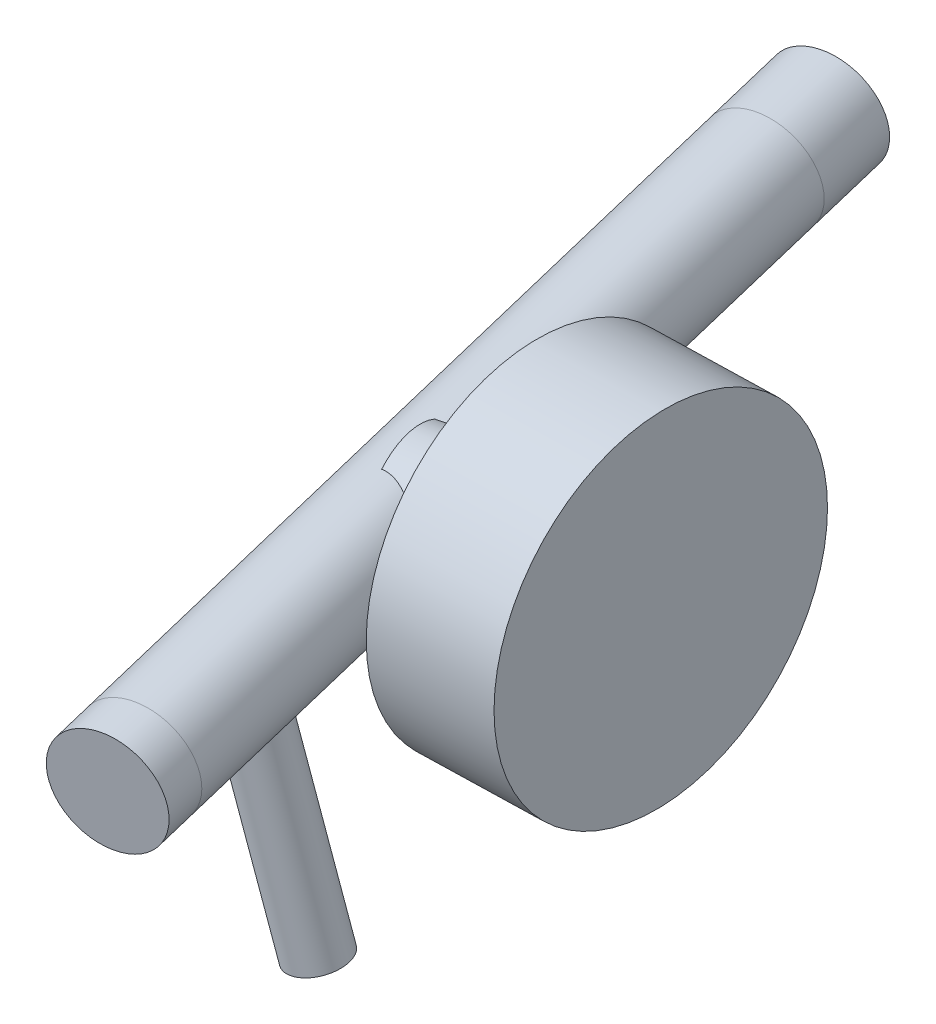
ISO-10303-21;
HEADER;
FILE_DESCRIPTION(('STEP AP214'),'2;1');
FILE_NAME('part.step','',(''),(''),'','','');
FILE_SCHEMA(('AUTOMOTIVE_DESIGN { 1 0 10303 214 1 1 1 1 }'));
ENDSEC;
DATA;
#1=APPLICATION_CONTEXT('core data for automotive mechanical design processes');
#2=APPLICATION_PROTOCOL_DEFINITION('international standard','automotive_design',2000,#1);
#3=PRODUCT_CONTEXT('',#1,'mechanical');
#4=PRODUCT('Part','Part','',(#3));
#5=PRODUCT_RELATED_PRODUCT_CATEGORY('part','',(#4));
#6=PRODUCT_DEFINITION_FORMATION('','',#4);
#7=PRODUCT_DEFINITION_CONTEXT('part definition',#1,'design');
#8=PRODUCT_DEFINITION('design','',#6,#7);
#9=PRODUCT_DEFINITION_SHAPE('','',#8);
#10=(LENGTH_UNIT() NAMED_UNIT(*) SI_UNIT(.MILLI.,.METRE.));
#11=(NAMED_UNIT(*) PLANE_ANGLE_UNIT() SI_UNIT($,.RADIAN.));
#12=(NAMED_UNIT(*) SI_UNIT($,.STERADIAN.) SOLID_ANGLE_UNIT());
#13=UNCERTAINTY_MEASURE_WITH_UNIT(LENGTH_MEASURE(1.E-05),#10,'distance_accuracy_value','');
#14=(GEOMETRIC_REPRESENTATION_CONTEXT(3) GLOBAL_UNCERTAINTY_ASSIGNED_CONTEXT((#13)) GLOBAL_UNIT_ASSIGNED_CONTEXT((#10,
#11,#12)) REPRESENTATION_CONTEXT('',''));
#15=CARTESIAN_POINT('',(0.,0.,0.));
#16=DIRECTION('',(0.,0.,1.));
#17=DIRECTION('',(1.,0.,0.));
#18=AXIS2_PLACEMENT_3D('',#15,#16,#17);
#19=CARTESIAN_POINT('',(563.274706,-121.170213,-161.19642));
#20=DIRECTION('',(0.984920558654944,0.0150785627794462,-0.172348861566705));
#21=DIRECTION('',(-0.172368457790249,0.,-0.985032545025296));
#22=AXIS2_PLACEMENT_3D('',#19,#20,#21);
#23=CYLINDRICAL_SURFACE('',#22,20.);
#24=CARTESIAN_POINT('',(563.274706,-121.170213,-161.19642));
#25=DIRECTION('',(0.984920558654944,0.0150785627794465,-0.172348861566706));
#26=DIRECTION('',(-0.172368457790251,0.,-0.985032545025295));
#27=AXIS2_PLACEMENT_3D('',#24,#25,#26);
#28=CIRCLE('',#27,20.);
#29=CARTESIAN_POINT('',(561.451962021397,-103.330507278104,-170.052068149323));
#30=VERTEX_POINT('',#29);
#31=CARTESIAN_POINT('',(565.097450244122,-105.139299613568,-149.377476755478));
#32=VERTEX_POINT('',#31);
#33=EDGE_CURVE('E115',#30,#32,#28,.T.);
#34=ORIENTED_EDGE('',*,*,#33,.T.);
#35=CARTESIAN_POINT('',(565.097450261875,-105.139299613296,-149.377476758585));
#36=CARTESIAN_POINT('',(565.241960516141,-105.137083588866,-149.402774584087));
#37=CARTESIAN_POINT('',(565.386980805246,-105.137031340531,-149.425204876547));
#38=CARTESIAN_POINT('',(565.677704553291,-105.141220484049,-149.46436991286));
#39=CARTESIAN_POINT('',(565.823407902906,-105.145461210693,-149.481105538585));
#40=CARTESIAN_POINT('',(566.260437352164,-105.164542841425,-149.52277644459));
#41=CARTESIAN_POINT('',(566.552346740213,-105.185733414749,-149.53929101681));
#42=CARTESIAN_POINT('',(567.130365317478,-105.243871269566,-149.551168167956));
#43=CARTESIAN_POINT('',(567.41649455295,-105.280570627843,-149.546852878375));
#44=CARTESIAN_POINT('',(567.98572318765,-105.368694426575,-149.520053879933));
#45=CARTESIAN_POINT('',(568.26882069855,-105.420127546954,-149.497559447147));
#46=CARTESIAN_POINT('',(568.948012761638,-105.56101604427,-149.424305968279));
#47=CARTESIAN_POINT('',(569.341823775265,-105.65737600961,-149.365658633244));
#48=CARTESIAN_POINT('',(570.118129795499,-105.874689209671,-149.224382395971));
#49=CARTESIAN_POINT('',(570.500619834506,-105.995653062454,-149.141743133167));
#50=CARTESIAN_POINT('',(571.25657979204,-106.261041628059,-148.958149565718));
#51=CARTESIAN_POINT('',(571.629946176678,-106.40565595235,-148.857046396206));
#52=CARTESIAN_POINT('',(572.36399707087,-106.715949564788,-148.642358961362));
#53=CARTESIAN_POINT('',(572.724682006115,-106.881628144986,-148.52877511551));
#54=CARTESIAN_POINT('',(573.608447444913,-107.319723287098,-148.235310004608));
#55=CARTESIAN_POINT('',(574.123784268325,-107.604452437082,-148.05038381113));
#56=CARTESIAN_POINT('',(575.125940054875,-108.216418846902,-147.673223018396));
#57=CARTESIAN_POINT('',(575.612745658161,-108.543675793407,-147.480985063764));
#58=CARTESIAN_POINT('',(576.555116835005,-109.238855525134,-147.0980261455));
#59=CARTESIAN_POINT('',(577.010753240993,-109.606680782739,-146.907302676313));
#60=CARTESIAN_POINT('',(577.889271424342,-110.383056823382,-146.533889170956));
#61=CARTESIAN_POINT('',(578.31216639752,-110.791591046007,-146.35119591133));
#62=CARTESIAN_POINT('',(579.032748476727,-111.555018847566,-146.03849600047));
#63=CARTESIAN_POINT('',(579.337570356056,-111.902059163816,-145.905714628828));
#64=CARTESIAN_POINT('',(579.922578685708,-112.620358042845,-145.651645101793));
#65=CARTESIAN_POINT('',(580.202765967737,-112.991615787267,-145.530356558372));
#66=CARTESIAN_POINT('',(580.73537080636,-113.757170485374,-145.302231310973));
#67=CARTESIAN_POINT('',(580.987818292337,-114.151441891137,-145.195379002107));
#68=CARTESIAN_POINT('',(581.46205306657,-114.962096637733,-144.998783923102));
#69=CARTESIAN_POINT('',(581.68384617092,-115.378475763234,-144.909037906136));
#70=CARTESIAN_POINT('',(582.056731471116,-116.155156221605,-144.763638449997));
#71=CARTESIAN_POINT('',(582.213376296272,-116.51219352015,-144.704758837835));
#72=CARTESIAN_POINT('',(582.501671183063,-117.238269119838,-144.601803081058));
#73=CARTESIAN_POINT('',(582.6333261385,-117.607305054656,-144.557724036723));
#74=CARTESIAN_POINT('',(582.86973029772,-118.355304210924,-144.485651779627));
#75=CARTESIAN_POINT('',(582.974489995994,-118.734263496494,-144.457652287356));
#76=CARTESIAN_POINT('',(583.155488770494,-119.499833518781,-144.418762922438));
#77=CARTESIAN_POINT('',(583.231727524344,-119.886444341932,-144.407873243182));
#78=CARTESIAN_POINT('',(583.354627163173,-120.666307220003,-144.403938278964));
#79=CARTESIAN_POINT('',(583.401148155809,-121.059581868019,-144.410976624662));
#80=CARTESIAN_POINT('',(583.463166456504,-121.847829281171,-144.443439479762));
#81=CARTESIAN_POINT('',(583.478663698087,-122.242802049943,-144.468864028559));
#82=CARTESIAN_POINT('',(583.478333127764,-123.031100953669,-144.538025933825));
#83=CARTESIAN_POINT('',(583.462507258412,-123.424427189219,-144.581762154532));
#84=CARTESIAN_POINT('',(583.399841008585,-124.20617446349,-144.687036856228));
#85=CARTESIAN_POINT('',(583.353001899656,-124.59459570265,-144.748574607295));
#86=CARTESIAN_POINT('',(583.233796937326,-125.334945080323,-144.883338996814));
#87=CARTESIAN_POINT('',(583.163582026433,-125.687443164019,-144.955360169771));
#88=CARTESIAN_POINT('',(582.99841117176,-126.38347400978,-145.11289186029));
#89=CARTESIAN_POINT('',(582.903456731908,-126.72700731542,-145.198401557754));
#90=CARTESIAN_POINT('',(582.690132577532,-127.403330927801,-145.381761318852));
#91=CARTESIAN_POINT('',(582.571761701771,-127.73612070081,-145.479611994396));
#92=CARTESIAN_POINT('',(582.313102893066,-128.389508070461,-145.686381605592));
#93=CARTESIAN_POINT('',(582.172813594106,-128.710104905657,-145.795301230944));
#94=CARTESIAN_POINT('',(581.859979240321,-129.362848351464,-146.031882926969));
#95=CARTESIAN_POINT('',(581.685760171206,-129.693901282103,-146.160346087757));
#96=CARTESIAN_POINT('',(581.315606309157,-130.339534029398,-146.426905900972));
#97=CARTESIAN_POINT('',(581.119670954881,-130.654113419922,-146.565002802386));
#98=CARTESIAN_POINT('',(580.70785199185,-131.266361406517,-146.849224194936));
#99=CARTESIAN_POINT('',(580.491957964938,-131.564021038301,-146.995352862226));
#100=CARTESIAN_POINT('',(580.042013876258,-132.14197114299,-147.293933980353));
#101=CARTESIAN_POINT('',(579.807960175128,-132.422258113904,-147.446387695923));
#102=CARTESIAN_POINT('',(579.203042339412,-133.10001037416,-147.832778633874));
#103=CARTESIAN_POINT('',(578.82188072403,-133.486675548024,-148.069640587698));
#104=CARTESIAN_POINT('',(578.02663598771,-134.221156489225,-148.548541701122));
#105=CARTESIAN_POINT('',(577.612537727767,-134.568954212814,-148.790583203652));
#106=CARTESIAN_POINT('',(576.753868930933,-135.226852595882,-149.274636870099));
#107=CARTESIAN_POINT('',(576.309238932286,-135.53687623453,-149.516648001155));
#108=CARTESIAN_POINT('',(575.392514847473,-136.118986925818,-149.993766900454));
#109=CARTESIAN_POINT('',(574.920429682023,-136.391086204293,-150.228876874068));
#110=CARTESIAN_POINT('',(574.060973825607,-136.839788636558,-150.632300121354));
#111=CARTESIAN_POINT('',(573.678945506471,-137.023994483254,-150.803584985096));
#112=CARTESIAN_POINT('',(572.899247380545,-137.370093496372,-151.132951019667));
#113=CARTESIAN_POINT('',(572.501575557605,-137.531983774553,-151.291030480316));
#114=CARTESIAN_POINT('',(571.691624780211,-137.832662260541,-151.587838689694));
#115=CARTESIAN_POINT('',(571.27938007594,-137.97150076901,-151.726609461227));
#116=CARTESIAN_POINT('',(570.439853741777,-138.225552676743,-151.977711222346));
#117=CARTESIAN_POINT('',(570.01258153258,-138.340780578686,-152.09005844875));
#118=CARTESIAN_POINT('',(569.29983348844,-138.509313935342,-152.245083761244));
#119=CARTESIAN_POINT('',(569.01838878165,-138.570015377388,-152.298302339811));
#120=CARTESIAN_POINT('',(568.45065284015,-138.680497310225,-152.38711436982));
#121=CARTESIAN_POINT('',(568.16436354549,-138.730282066187,-152.422714711596));
#122=CARTESIAN_POINT('',(567.589111853375,-138.818172459285,-152.473340678825));
#123=CARTESIAN_POINT('',(567.300161310986,-138.856315886469,-152.48843343885));
#124=CARTESIAN_POINT('',(566.720726268049,-138.920487850404,-152.495674129945));
#125=CARTESIAN_POINT('',(566.430242941699,-138.94652459196,-152.487837626714));
#126=CARTESIAN_POINT('',(565.965816473623,-138.97813124537,-152.455542875465));
#127=CARTESIAN_POINT('',(565.791565694483,-138.987722485243,-152.438953686409));
#128=CARTESIAN_POINT('',(565.443780929702,-139.002298909353,-152.396705958622));
#129=CARTESIAN_POINT('',(565.270247939184,-139.007279032974,-152.371037498138));
#130=CARTESIAN_POINT('',(565.097449800445,-139.009919269266,-152.340772916684));
#131=B_SPLINE_CURVE_WITH_KNOTS('',3,(#35,#36,#37,#38,#39,#40,#41,#42,#43,#44,#45,#46,#47,#48,
#49,#50,#51,#52,#53,#54,#55,#56,#57,#58,#59,#60,#61,#62,#63,#64,#65,#66,#67,#68,#69,#70,#71,#72,
#73,#74,#75,#76,#77,#78,#79,#80,#81,#82,#83,#84,#85,#86,#87,#88,#89,#90,#91,#92,#93,#94,#95,#96,
#97,#98,#99,#100,#101,#102,#103,#104,#105,#106,#107,#108,#109,#110,#111,#112,#113,#114,#115,
#116,#117,#118,#119,#120,#121,#122,#123,#124,#125,#126,#127,#128,#129,#130),.UNSPECIFIED.,.F.,
.F.,(4,2,2,2,2,2,2,2,2,2,2,2,2,2,2,2,2,2,2,2,2,2,2,2,2,2,2,2,2,2,2,2,2,2,2,2,2,2,2,2,2,2,2,2,2,
2,2,4),(0.,0.440081998992973,0.880095816169694,1.75811046014233,2.62259060424829,
3.48758108009866,4.71450352314653,5.941956584969,7.17978187290634,8.41756556970351,
10.2664759007439,12.1162451856898,13.9616606924029,15.8063285250476,17.2469132164531,
18.6874492526778,20.1264154614484,21.5651082774872,22.7468834260874,23.9284269066243,
25.1095086474576,26.2906037378723,27.477218481101,28.6638357669129,29.8503794650045,
31.0368745177465,32.1353689465517,33.2337966129062,34.3322787646682,35.4308294042187,
36.6163133561156,37.8018279585501,38.9879649158235,40.1743402027566,41.9489029694166,
43.7242861630413,45.5032308194404,47.2816006570033,48.6529217548134,50.0244201725593,
51.392885387039,52.7605074930709,53.6382434358771,54.5156358322066,55.3901489793773,
56.2640685945909,56.7896991674733,57.3159059288317),.UNSPECIFIED.);
#132=CARTESIAN_POINT('',(565.097449782692,-139.009919269538,-152.340772913578));
#133=VERTEX_POINT('',#132);
#134=EDGE_CURVE('E88',#32,#133,#131,.T.);
#135=ORIENTED_EDGE('',*,*,#134,.T.);
#136=CARTESIAN_POINT('',(561.451961916283,-137.201127110868,-173.015362286653));
#137=VERTEX_POINT('',#136);
#138=EDGE_CURVE('E117',#133,#137,#28,.T.);
#139=ORIENTED_EDGE('',*,*,#138,.T.);
#140=CARTESIAN_POINT('',(561.451961916283,-137.201127110868,-173.015362286653));
#141=CARTESIAN_POINT('',(561.596475774193,-137.198918343692,-173.040640090079));
#142=CARTESIAN_POINT('',(561.740431338349,-137.194546539523,-173.068776981821));
#143=CARTESIAN_POINT('',(562.026923570595,-137.181520555105,-173.130617570928));
#144=CARTESIAN_POINT('',(562.16946045506,-137.172867038428,-173.164320405153));
#145=CARTESIAN_POINT('',(562.593908481912,-137.140596690352,-173.273397354659));
#146=CARTESIAN_POINT('',(562.8733205658,-137.110659519892,-173.356856941975));
#147=CARTESIAN_POINT('',(563.419042641467,-137.035317856116,-173.541620443552));
#148=CARTESIAN_POINT('',(563.685488206991,-136.990158903552,-173.642629457861));
#149=CARTESIAN_POINT('',(564.208925331307,-136.885307038772,-173.860631388034));
#150=CARTESIAN_POINT('',(564.465911216226,-136.825605562407,-173.977633704534));
#151=CARTESIAN_POINT('',(565.075390503512,-136.66498827282,-174.276388660195));
#152=CARTESIAN_POINT('',(565.422853910795,-136.557279837549,-174.464749811331));
#153=CARTESIAN_POINT('',(566.098269911367,-136.317741641179,-174.860059370531));
#154=CARTESIAN_POINT('',(566.426214001639,-136.185901468245,-175.067015781971));
#155=CARTESIAN_POINT('',(567.066707236506,-135.899134045552,-175.494971313919));
#156=CARTESIAN_POINT('',(567.379102873536,-135.744021119482,-175.716074320251));
#157=CARTESIAN_POINT('',(567.987108438757,-135.413181437718,-176.165604968064));
#158=CARTESIAN_POINT('',(568.282718930598,-135.237455374828,-176.394032363188));
#159=CARTESIAN_POINT('',(569.000935691753,-134.774834843522,-176.96782448798));
#160=CARTESIAN_POINT('',(569.414183373108,-134.47588961064,-177.315241463145));
#161=CARTESIAN_POINT('',(570.210124244169,-133.83639539685,-178.007046893443));
#162=CARTESIAN_POINT('',(570.592803149887,-133.495827152478,-178.351433866625));
#163=CARTESIAN_POINT('',(571.328098199049,-132.774963333566,-179.027963595937));
#164=CARTESIAN_POINT('',(571.680782980852,-132.394763151432,-179.360133263274));
#165=CARTESIAN_POINT('',(572.356876410601,-131.594586914872,-180.005584552759));
#166=CARTESIAN_POINT('',(572.680296861944,-131.174627038136,-180.318873772914));
#167=CARTESIAN_POINT('',(573.228905565215,-130.391768662088,-180.853666363126));
#168=CARTESIAN_POINT('',(573.460092724757,-130.036522356738,-181.080242684446));
#169=CARTESIAN_POINT('',(573.902488971283,-129.302494504557,-181.514095302292));
#170=CARTESIAN_POINT('',(574.113698732754,-128.923713753024,-181.72137225041));
#171=CARTESIAN_POINT('',(574.514232987356,-128.143873227879,-182.112785299927));
#172=CARTESIAN_POINT('',(574.703581079183,-127.742838182707,-182.296946372966));
#173=CARTESIAN_POINT('',(575.058604385182,-126.919487962954,-182.63865136668));
#174=CARTESIAN_POINT('',(575.224284090187,-126.497176845913,-182.796200337767));
#175=CARTESIAN_POINT('',(575.502415024498,-125.710529697003,-183.05551959245));
#176=CARTESIAN_POINT('',(575.619088150776,-125.34930805776,-183.162226470138));
#177=CARTESIAN_POINT('',(575.833605218308,-124.615534694602,-183.35316811142));
#178=CARTESIAN_POINT('',(575.931452846238,-124.24298520565,-183.437407276211));
#179=CARTESIAN_POINT('',(576.107019282956,-123.488679011655,-183.581569308498));
#180=CARTESIAN_POINT('',(576.184745943016,-123.106925961631,-183.641501665784));
#181=CARTESIAN_POINT('',(576.318967418002,-122.336530090298,-183.735550696711));
#182=CARTESIAN_POINT('',(576.375461992939,-121.947887191165,-183.769667078553));
#183=CARTESIAN_POINT('',(576.466504802467,-121.164748964884,-183.81103935094));
#184=CARTESIAN_POINT('',(576.500949240595,-120.770234775361,-183.818168968284));
#185=CARTESIAN_POINT('',(576.546863264162,-119.980334963957,-183.804592965189));
#186=CARTESIAN_POINT('',(576.558332800373,-119.584949340211,-183.783887285107));
#187=CARTESIAN_POINT('',(576.558088134476,-118.796659223221,-183.714624754763));
#188=CARTESIAN_POINT('',(576.546375370059,-118.403754577632,-183.666069631766));
#189=CARTESIAN_POINT('',(576.499981511356,-117.623676928183,-183.541710797662));
#190=CARTESIAN_POINT('',(576.465301358734,-117.23650369,-183.465908203762));
#191=CARTESIAN_POINT('',(576.376994723135,-116.499331177927,-183.294831891884));
#192=CARTESIAN_POINT('',(576.324964237156,-116.148704595302,-183.201419307716));
#193=CARTESIAN_POINT('',(576.202489226043,-115.457077430038,-182.993553192708));
#194=CARTESIAN_POINT('',(576.132045820239,-115.116076263661,-182.879100941004));
#195=CARTESIAN_POINT('',(575.973654086947,-114.445443393686,-182.630695544795));
#196=CARTESIAN_POINT('',(575.885704891335,-114.115812254888,-182.496741433267));
#197=CARTESIAN_POINT('',(575.693321272239,-113.469330069946,-182.211045026664));
#198=CARTESIAN_POINT('',(575.588885821282,-113.152479821893,-182.059301623059));
#199=CARTESIAN_POINT('',(575.355710092928,-112.508095465536,-181.727174974483));
#200=CARTESIAN_POINT('',(575.225700467895,-112.181700098053,-181.545475587865));
#201=CARTESIAN_POINT('',(574.949025321608,-111.545969923572,-181.165728766021));
#202=CARTESIAN_POINT('',(574.802359369804,-111.23663555789,-180.96768090824));
#203=CARTESIAN_POINT('',(574.493501029906,-110.635420717318,-180.557349972634));
#204=CARTESIAN_POINT('',(574.331300531381,-110.343549490377,-180.345059476383));
#205=CARTESIAN_POINT('',(573.992493202512,-109.777674705827,-179.908456690555));
#206=CARTESIAN_POINT('',(573.815883484063,-109.50367475014,-179.684141994019));
#207=CARTESIAN_POINT('',(573.358226666746,-108.842189891322,-179.111813738156));
#208=CARTESIAN_POINT('',(573.068812260476,-108.465790849612,-178.757609341655));
#209=CARTESIAN_POINT('',(572.461944302498,-107.752775442624,-178.033355986621));
#210=CARTESIAN_POINT('',(572.144477849419,-107.416177550373,-177.66329977844));
#211=CARTESIAN_POINT('',(571.482006559764,-106.781566937538,-176.913065555952));
#212=CARTESIAN_POINT('',(571.136947758034,-106.483632974284,-176.532868726205));
#213=CARTESIAN_POINT('',(570.419793265486,-105.926536010436,-175.769841435513));
#214=CARTESIAN_POINT('',(570.047706346949,-105.66736051314,-175.387011865251));
#215=CARTESIAN_POINT('',(569.363334693363,-105.242293164537,-174.713438021356));
#216=CARTESIAN_POINT('',(569.056855554989,-105.068627953117,-174.421672914181));
#217=CARTESIAN_POINT('',(568.425372222731,-104.744133282667,-173.845367672856));
#218=CARTESIAN_POINT('',(568.100365638572,-104.593306779339,-173.560828477816));
#219=CARTESIAN_POINT('',(567.430736386187,-104.315279783006,-173.005112163124));
#220=CARTESIAN_POINT('',(567.086158690519,-104.188027776476,-172.733906883659));
#221=CARTESIAN_POINT('',(566.374591947334,-103.95772218654,-172.211383124482));
#222=CARTESIAN_POINT('',(566.007616838196,-103.854653742841,-171.9600524955));
#223=CARTESIAN_POINT('',(565.385161215739,-103.706561567288,-171.571383143238));
#224=CARTESIAN_POINT('',(565.13682933224,-103.653970692114,-171.425460246565));
#225=CARTESIAN_POINT('',(564.629949814245,-103.559940489812,-171.148603870143));
#226=CARTESIAN_POINT('',(564.371406216244,-103.518496806016,-171.017664545879));
#227=CARTESIAN_POINT('',(563.845167721208,-103.447469584084,-170.774291491631));
#228=CARTESIAN_POINT('',(563.577505639281,-103.417847572025,-170.661798443801));
#229=CARTESIAN_POINT('',(563.033309419363,-103.370877750508,-170.457936255044));
#230=CARTESIAN_POINT('',(562.75678142613,-103.353521624196,-170.366552829142));
#231=CARTESIAN_POINT('',(562.308254068043,-103.335891769763,-170.239092020403));
#232=CARTESIAN_POINT('',(562.138517583854,-103.331566778106,-170.195487719269));
#233=CARTESIAN_POINT('',(561.796776268783,-103.327546602081,-170.117076959334));
#234=CARTESIAN_POINT('',(561.624769155334,-103.327856498031,-170.082280196984));
#235=CARTESIAN_POINT('',(561.451962021397,-103.330507278104,-170.052068149323));
#236=B_SPLINE_CURVE_WITH_KNOTS('',3,(#140,#141,#142,#143,#144,#145,#146,#147,#148,#149,#150,
#151,#152,#153,#154,#155,#156,#157,#158,#159,#160,#161,#162,#163,#164,#165,#166,#167,#168,#169,
#170,#171,#172,#173,#174,#175,#176,#177,#178,#179,#180,#181,#182,#183,#184,#185,#186,#187,#188,
#189,#190,#191,#192,#193,#194,#195,#196,#197,#198,#199,#200,#201,#202,#203,#204,#205,#206,#207,
#208,#209,#210,#211,#212,#213,#214,#215,#216,#217,#218,#219,#220,#221,#222,#223,#224,#225,#226,
#227,#228,#229,#230,#231,#232,#233,#234,#235),.UNSPECIFIED.,.F.,.F.,(4,2,2,2,2,2,2,2,2,2,2,2,2,
2,2,2,2,2,2,2,2,2,2,2,2,2,2,2,2,2,2,2,2,2,2,2,2,2,2,2,2,2,2,2,2,2,2,4),(0.,0.440081966269956,
0.880095750720164,1.75811032918481,2.62259040753398,3.48758081763614,4.71450319630769,
5.94195619378947,7.17978141800502,8.41756505105628,10.2664754441186,12.1162447913023,
13.961660359893,15.8063282543343,17.2469130009829,18.6874490924772,20.1264153563837,
21.5651082275139,22.746883399971,23.9284269043434,25.1095086690055,26.2906037832494,
27.4772185516247,28.6638358625835,29.8503795856782,31.0368746634006,32.1353690951185,
33.2337967643714,34.3322789190232,35.430829561462,36.6163134944204,37.8018280779,
38.9879650161424,40.1743402840355,41.9489029818614,43.7242861065503,45.5032306939888,
47.2816004627086,48.652921594983,50.0244200471872,51.3928852958659,52.7605074361077,
53.6382434358586,54.5156358891194,55.3901490933521,56.2640687655747,56.7896992324834,
57.3159058871337),.UNSPECIFIED.);
#237=EDGE_CURVE('E107',#137,#30,#236,.T.);
#238=ORIENTED_EDGE('',*,*,#237,.T.);
#239=EDGE_LOOP('',(#34,#135,#139,#238));
#240=FACE_BOUND('',#239,.T.);
#241=CARTESIAN_POINT('',(593.668851124536,-120.704896258096,-166.515017793979));
#242=DIRECTION('',(0.999657324931295,0.,-0.0261769499982009));
#243=DIRECTION('',(-0.0260394017219689,0.102379214978631,-0.994404568522451));
#244=AXIS2_PLACEMENT_3D('',#241,#242,#243);
#245=ELLIPSE('',#244,20.2205124025565,20.);
#246=CARTESIAN_POINT('',(593.142321079061,-118.634736071856,-186.622387704946));
#247=VERTEX_POINT('',#246);
#248=EDGE_CURVE('E83',#247,#247,#245,.F.);
#249=ORIENTED_EDGE('',*,*,#248,.T.);
#250=EDGE_LOOP('',(#249));
#251=FACE_BOUND('',#250,.T.);
#252=ADVANCED_FACE('F79',(#240,#251),#23,.T.);
#253=CARTESIAN_POINT('',(534.716988,-107.000649,-323.155287));
#254=DIRECTION('',(-0.173007190424965,0.0858414606043045,-0.981172643168662));
#255=DIRECTION('',(-0.984807756324709,0.,0.173648158880805));
#256=AXIS2_PLACEMENT_3D('',#253,#254,#255);
#257=PLANE('',#256);
#258=CARTESIAN_POINT('',(534.716988,-107.000649,-323.155287));
#259=DIRECTION('',(-0.173007190424965,0.0858414606043045,-0.981172643168662));
#260=DIRECTION('',(-0.984807756324709,0.,0.173648158880805));
#261=AXIS2_PLACEMENT_3D('',#258,#259,#260);
#262=CIRCLE('',#261,17.);
#263=CARTESIAN_POINT('',(517.97525614248,-107.000649,-320.203268299026));
#264=VERTEX_POINT('',#263);
#265=EDGE_CURVE('E118',#264,#264,#262,.T.);
#266=ORIENTED_EDGE('',*,*,#265,.T.);
#267=EDGE_LOOP('',(#266));
#268=FACE_BOUND('',#267,.T.);
#269=ADVANCED_FACE('F81',(#268),#257,.T.);
#270=CARTESIAN_POINT('',(539.215175,-109.232527,-297.644798));
#271=DIRECTION('',(-0.173007190424964,0.085841460604302,-0.981172643168663));
#272=DIRECTION('',(-0.984807756324709,0.,0.173648158880804));
#273=AXIS2_PLACEMENT_3D('',#270,#271,#272);
#274=CYLINDRICAL_SURFACE('',#273,17.);
#275=ORIENTED_EDGE('',*,*,#265,.F.);
#276=EDGE_LOOP('',(#275));
#277=FACE_BOUND('',#276,.T.);
#278=CARTESIAN_POINT('',(539.215175787186,-109.232527302237,-297.644798165244));
#279=DIRECTION('',(-0.173007190424965,0.0858414606043045,-0.981172643168662));
#280=DIRECTION('',(-0.984807756324709,0.,0.173648158880805));
#281=AXIS2_PLACEMENT_3D('',#278,#279,#280);
#282=CIRCLE('',#281,17.);
#283=CARTESIAN_POINT('',(522.473443929666,-109.232527302237,-294.692779464271));
#284=VERTEX_POINT('',#283);
#285=EDGE_CURVE('E132',#284,#284,#282,.T.);
#286=ORIENTED_EDGE('',*,*,#285,.T.);
#287=EDGE_LOOP('',(#286));
#288=FACE_BOUND('',#287,.T.);
#289=ADVANCED_FACE('F153',(#277,#288),#274,.T.);
#290=CARTESIAN_POINT('',(582.,-130.461196,-55.));
#291=DIRECTION('',(-0.173007207138552,0.0858414811850425,-0.981172638421025));
#292=DIRECTION('',(-0.984807753312239,0.,0.173648175965372));
#293=AXIS2_PLACEMENT_3D('',#290,#291,#292);
#294=CYLINDRICAL_SURFACE('',#293,17.);
#295=CARTESIAN_POINT('',(586.668334642204,-139.422971452006,-95.9679980488224));
#296=CARTESIAN_POINT('',(586.678344575348,-139.474275859069,-95.7262524940842));
#297=CARTESIAN_POINT('',(586.679533963386,-139.533201393419,-95.4857237062152));
#298=CARTESIAN_POINT('',(586.664385127774,-139.66482680038,-95.008923191832));
#299=CARTESIAN_POINT('',(586.648036176401,-139.737535081111,-94.7726541608265));
#300=CARTESIAN_POINT('',(586.598004588681,-139.89508945488,-94.3054796323329));
#301=CARTESIAN_POINT('',(586.564282793142,-139.979962654922,-94.0745874887527));
#302=CARTESIAN_POINT('',(586.479823800035,-140.159772751552,-93.6198976220195));
#303=CARTESIAN_POINT('',(586.429078580468,-140.254714378263,-93.3961032981154));
#304=CARTESIAN_POINT('',(586.252658437982,-140.550219242493,-92.7400380401649));
#305=CARTESIAN_POINT('',(586.102405253026,-140.762727093406,-92.3194854996735));
#306=CARTESIAN_POINT('',(585.738593676693,-141.204217423608,-91.5164740032101));
#307=CARTESIAN_POINT('',(585.525048248853,-141.433196521984,-91.1340072679021));
#308=CARTESIAN_POINT('',(585.14752497824,-141.789179812947,-90.5759077526411));
#309=CARTESIAN_POINT('',(585.004889512035,-141.915408352704,-90.3850405936966));
#310=CARTESIAN_POINT('',(584.701671849263,-142.166425451919,-90.0171691127501));
#311=CARTESIAN_POINT('',(584.54109635424,-142.291214529999,-89.8401596559117));
#312=CARTESIAN_POINT('',(584.202389645426,-142.537265844849,-89.5009837575762));
#313=CARTESIAN_POINT('',(584.024253392783,-142.658527056336,-89.3388216022319));
#314=CARTESIAN_POINT('',(583.65109753906,-142.895396897795,-89.0305675253861));
#315=CARTESIAN_POINT('',(583.456078865649,-143.011005837807,-88.8844747218938));
#316=CARTESIAN_POINT('',(583.054337743466,-143.232185166515,-88.6125160649389));
#317=CARTESIAN_POINT('',(582.847948693256,-143.337915801164,-88.486288729701));
#318=CARTESIAN_POINT('',(582.421004297144,-143.540209986384,-88.2516489982309));
#319=CARTESIAN_POINT('',(582.200448964186,-143.63677354533,-88.1432365857223));
#320=CARTESIAN_POINT('',(581.746880846385,-143.819002934021,-87.9454797851732));
#321=CARTESIAN_POINT('',(581.513878555069,-143.904677743952,-87.8561196425574));
#322=CARTESIAN_POINT('',(581.037141996305,-144.063801561906,-87.6973956815028));
#323=CARTESIAN_POINT('',(580.793409047311,-144.137252066635,-87.6280294143144));
#324=CARTESIAN_POINT('',(580.325064049544,-144.263397345375,-87.5166664368196));
#325=CARTESIAN_POINT('',(580.101345604124,-144.317492659512,-87.4724819443375));
#326=CARTESIAN_POINT('',(579.648897016834,-144.414665828414,-87.4009092850003));
#327=CARTESIAN_POINT('',(579.420167299278,-144.457744612086,-87.3735197017361));
#328=CARTESIAN_POINT('',(578.959520421409,-144.532635808061,-87.3357147900129));
#329=CARTESIAN_POINT('',(578.727603660106,-144.564449617596,-87.3252973558635));
#330=CARTESIAN_POINT('',(578.262368129308,-144.616844833006,-87.321405070756));
#331=CARTESIAN_POINT('',(578.029049351687,-144.637426173718,-87.3279303180847));
#332=CARTESIAN_POINT('',(577.571817867477,-144.667054791882,-87.3571382899737));
#333=CARTESIAN_POINT('',(577.347890699054,-144.67651774394,-87.3791857280788));
#334=CARTESIAN_POINT('',(576.901780849684,-144.685781030611,-87.4384409465859));
#335=CARTESIAN_POINT('',(576.679598797506,-144.685578029135,-87.475653956812));
#336=CARTESIAN_POINT('',(576.238477867409,-144.676118763037,-87.564827273729));
#337=CARTESIAN_POINT('',(576.019538223593,-144.666864672178,-87.6167840373482));
#338=CARTESIAN_POINT('',(575.586001888849,-144.640051151295,-87.7350144739755));
#339=CARTESIAN_POINT('',(575.371406921682,-144.62248848965,-87.8012937122608));
#340=CARTESIAN_POINT('',(574.931779148373,-144.578301413102,-87.9532057977665));
#341=CARTESIAN_POINT('',(574.707178784256,-144.551093749971,-88.0399208634378));
#342=CARTESIAN_POINT('',(574.265559366205,-144.489204526382,-88.2287997161562));
#343=CARTESIAN_POINT('',(574.048542954885,-144.454520390352,-88.3309688233435));
#344=CARTESIAN_POINT('',(573.623197450811,-144.378902997844,-88.5502491136278));
#345=CARTESIAN_POINT('',(573.414872599785,-144.337966734539,-88.6673674817781));
#346=CARTESIAN_POINT('',(573.008080662316,-144.251157602911,-88.9160228697048));
#347=CARTESIAN_POINT('',(572.809614295667,-144.2052843749,-89.047560940059));
#348=CARTESIAN_POINT('',(572.403082683174,-144.104892745583,-89.3393344416253));
#349=CARTESIAN_POINT('',(572.196235904213,-144.049973587682,-89.5011339760994));
#350=CARTESIAN_POINT('',(571.797407288992,-143.937682896914,-89.841223986578));
#351=CARTESIAN_POINT('',(571.605420674044,-143.880312161705,-90.0195091203779));
#352=CARTESIAN_POINT('',(571.237699507676,-143.765062399481,-90.392113199083));
#353=CARTESIAN_POINT('',(571.061970129436,-143.707183217046,-90.5864372107196));
#354=CARTESIAN_POINT('',(570.72846827446,-143.592967515897,-90.9904170743157));
#355=CARTESIAN_POINT('',(570.570697523519,-143.53663114584,-91.2000743966073));
#356=CARTESIAN_POINT('',(570.276243418794,-143.428052189475,-91.6318355405243));
#357=CARTESIAN_POINT('',(570.139381966742,-143.37577713831,-91.8538093902538));
#358=CARTESIAN_POINT('',(569.886898314025,-143.276712846804,-92.3105521731535));
#359=CARTESIAN_POINT('',(569.771263816632,-143.229920436101,-92.5453135956418));
#360=CARTESIAN_POINT('',(569.562967186789,-143.143556021027,-93.0257671729147));
#361=CARTESIAN_POINT('',(569.470277189159,-143.10397527396,-93.2714456372078));
#362=CARTESIAN_POINT('',(569.309148489295,-143.033314807168,-93.7718020457209));
#363=CARTESIAN_POINT('',(569.240705363404,-143.002233537013,-94.0264783390216));
#364=CARTESIAN_POINT('',(569.13702990509,-142.95314690132,-94.5053851316513));
#365=CARTESIAN_POINT('',(569.098451395016,-142.933908298331,-94.7287719593482));
#366=CARTESIAN_POINT('',(569.040127601372,-142.902397239657,-95.1784589205786));
#367=CARTESIAN_POINT('',(569.020380339792,-142.890124052388,-95.4047587456035));
#368=CARTESIAN_POINT('',(568.9996894506,-142.872332803932,-95.8585167059374));
#369=CARTESIAN_POINT('',(568.998749996677,-142.866816242381,-96.0859750871432));
#370=CARTESIAN_POINT('',(569.01536085877,-142.862014458793,-96.5402718148712));
#371=CARTESIAN_POINT('',(569.032911696322,-142.862729412527,-96.7671101437233));
#372=CARTESIAN_POINT('',(569.084943667264,-142.869478643367,-97.2099899843422));
#373=CARTESIAN_POINT('',(569.11875532598,-142.875309524303,-97.4261139450465));
#374=CARTESIAN_POINT('',(569.202356029517,-142.891159177146,-97.8551230851167));
#375=CARTESIAN_POINT('',(569.252150456662,-142.901179360179,-98.06800714809));
#376=CARTESIAN_POINT('',(569.424471560865,-142.93611332304,-98.7000300055954));
#377=CARTESIAN_POINT('',(569.569967266814,-142.965906496289,-99.1127947962712));
#378=CARTESIAN_POINT('',(569.939221609597,-143.03468854559,-99.9658778386352));
#379=CARTESIAN_POINT('',(570.17069587379,-143.074369369984,-100.402801676529));
#380=CARTESIAN_POINT('',(570.565534216761,-143.130206972036,-101.028066274881));
#381=CARTESIAN_POINT('',(570.705198584948,-143.14821680999,-101.231598687853));
#382=CARTESIAN_POINT('',(570.999695973792,-143.181708317294,-101.627716634441));
#383=CARTESIAN_POINT('',(571.154531306628,-143.197189600309,-101.820300492316));
#384=CARTESIAN_POINT('',(571.494917415093,-143.225728953759,-102.212272568903));
#385=CARTESIAN_POINT('',(571.681990720393,-143.238382087691,-102.410370350447));
#386=CARTESIAN_POINT('',(572.072198152094,-143.257496258778,-102.790251096367));
#387=CARTESIAN_POINT('',(572.275325964488,-143.263959717256,-102.972040415162));
#388=CARTESIAN_POINT('',(572.696354349026,-143.269262443816,-103.31773340888));
#389=CARTESIAN_POINT('',(572.91425332835,-143.268102532661,-103.481639007302));
#390=CARTESIAN_POINT('',(573.363278486944,-143.256894218979,-103.789867260709));
#391=CARTESIAN_POINT('',(573.594403370375,-143.246846685848,-103.934191829538));
#392=CARTESIAN_POINT('',(574.055001209267,-143.217658164184,-104.194196117237));
#393=CARTESIAN_POINT('',(574.283864058518,-143.199048485279,-104.31101569145));
#394=CARTESIAN_POINT('',(574.749971067009,-143.152338843079,-104.524301868924));
#395=CARTESIAN_POINT('',(574.987214996657,-143.124239139574,-104.620769029217));
#396=CARTESIAN_POINT('',(575.467868457034,-143.058223074847,-104.792100101415));
#397=CARTESIAN_POINT('',(575.711273427376,-143.020313793408,-104.866979511605));
#398=CARTESIAN_POINT('',(576.202176301436,-142.934639970226,-104.994298663262));
#399=CARTESIAN_POINT('',(576.449673804156,-142.886876388831,-105.04674058984));
#400=CARTESIAN_POINT('',(576.91977756882,-142.787447028167,-105.124218578329));
#401=CARTESIAN_POINT('',(577.142207386844,-142.736748748699,-105.151590229217));
#402=CARTESIAN_POINT('',(577.586811460053,-142.628195862628,-105.187836189591));
#403=CARTESIAN_POINT('',(577.808985735273,-142.570341862046,-105.196712064357));
#404=CARTESIAN_POINT('',(578.251490003905,-142.44810908697,-105.196048023633));
#405=CARTESIAN_POINT('',(578.471820031971,-142.383730435373,-105.186508454952));
#406=CARTESIAN_POINT('',(578.909170505518,-142.249241633633,-105.149317043729));
#407=CARTESIAN_POINT('',(579.126190866399,-142.17913133727,-105.121664738986));
#408=CARTESIAN_POINT('',(579.553186537034,-142.034916174919,-105.049137860689));
#409=CARTESIAN_POINT('',(579.76321367347,-141.960865215407,-105.00446083913));
#410=CARTESIAN_POINT('',(580.177680622859,-141.809036546271,-104.898469499967));
#411=CARTESIAN_POINT('',(580.382118459728,-141.731257544692,-104.83714937986));
#412=CARTESIAN_POINT('',(580.98547926375,-141.493928790951,-104.629250074255));
#413=CARTESIAN_POINT('',(581.374743008043,-141.330286294796,-104.458680819837));
#414=CARTESIAN_POINT('',(582.15579174673,-140.985898565769,-104.040968363297));
#415=CARTESIAN_POINT('',(582.544484845812,-140.804970448887,-103.788205087348));
#416=CARTESIAN_POINT('',(583.095004572592,-140.541198946906,-103.362789000951));
#417=CARTESIAN_POINT('',(583.273211084481,-140.454483823252,-103.213143741369));
#418=CARTESIAN_POINT('',(583.618384144922,-140.285157899916,-102.899136053049));
#419=CARTESIAN_POINT('',(583.785348881305,-140.202547762515,-102.734771261431));
#420=CARTESIAN_POINT('',(584.122583357153,-140.03564870544,-102.376096168088));
#421=CARTESIAN_POINT('',(584.291688815514,-139.951931751262,-102.180423303869));
#422=CARTESIAN_POINT('',(584.614947971349,-139.7937817871,-101.773705153005));
#423=CARTESIAN_POINT('',(584.769107599666,-139.71934509112,-101.562666022735));
#424=CARTESIAN_POINT('',(585.06175479389,-139.582075629698,-101.126330915179));
#425=CARTESIAN_POINT('',(585.200239514326,-139.519244969801,-100.901032360911));
#426=CARTESIAN_POINT('',(585.460544520141,-139.407598718758,-100.437690768605));
#427=CARTESIAN_POINT('',(585.582367038299,-139.358781248841,-100.199649444092));
#428=CARTESIAN_POINT('',(585.802845739278,-139.279385167369,-99.724394614744));
#429=CARTESIAN_POINT('',(585.90233747787,-139.248038531021,-99.4876980482143));
#430=CARTESIAN_POINT('',(586.084367572539,-139.201756779613,-99.0062536527276));
#431=CARTESIAN_POINT('',(586.166904415317,-139.186823128968,-98.7615051073557));
#432=CARTESIAN_POINT('',(586.313927730575,-139.174609403339,-98.2669093075634));
#433=CARTESIAN_POINT('',(586.378461541832,-139.177282566524,-98.0170773143093));
#434=CARTESIAN_POINT('',(586.489013358371,-139.200748458743,-97.5143174903724));
#435=CARTESIAN_POINT('',(586.53504319874,-139.221529578947,-97.26139174547));
#436=CARTESIAN_POINT('',(586.596671813834,-139.27165054727,-96.8345636331209));
#437=CARTESIAN_POINT('',(586.617287813369,-139.296250767229,-96.660797408154));
#438=CARTESIAN_POINT('',(586.649544958249,-139.353597295232,-96.3138134607126));
#439=CARTESIAN_POINT('',(586.661187911843,-139.386341960244,-96.1405956347352));
#440=CARTESIAN_POINT('',(586.668334642204,-139.422971452006,-95.9679980488224));
#441=B_SPLINE_CURVE_WITH_KNOTS('',3,(#295,#296,#297,#298,#299,#300,#301,#302,#303,#304,#305,
#306,#307,#308,#309,#310,#311,#312,#313,#314,#315,#316,#317,#318,#319,#320,#321,#322,#323,#324,
#325,#326,#327,#328,#329,#330,#331,#332,#333,#334,#335,#336,#337,#338,#339,#340,#341,#342,#343,
#344,#345,#346,#347,#348,#349,#350,#351,#352,#353,#354,#355,#356,#357,#358,#359,#360,#361,#362,
#363,#364,#365,#366,#367,#368,#369,#370,#371,#372,#373,#374,#375,#376,#377,#378,#379,#380,#381,
#382,#383,#384,#385,#386,#387,#388,#389,#390,#391,#392,#393,#394,#395,#396,#397,#398,#399,#400,
#401,#402,#403,#404,#405,#406,#407,#408,#409,#410,#411,#412,#413,#414,#415,#416,#417,#418,#419,
#420,#421,#422,#423,#424,#425,#426,#427,#428,#429,#430,#431,#432,#433,#434,#435,#436,#437,#438,
#439,#440),.UNSPECIFIED.,.T.,.F.,(4,2,2,2,2,2,2,2,2,2,2,2,2,2,2,2,2,2,2,2,2,2,2,2,2,2,2,2,2,2,2,
2,2,2,2,2,2,2,2,2,2,2,2,2,2,2,2,2,2,2,2,2,2,2,2,2,2,2,2,2,2,2,2,2,2,2,2,2,2,2,2,2,4),(0.,
0.741797712847722,1.48404942195441,2.22798156871446,2.97226477446699,4.44946514137369,
5.9263631564727,6.7344825106964,7.5423009927849,8.35035194727587,9.15835852851381,
9.94933138894379,10.7403035267079,11.5306190403268,12.3208377188963,13.023049501556,
13.725202054597,14.4272674867593,15.1293369917097,15.8042271672165,16.4793502747596,
17.1543112806452,17.8295350289353,18.5556536533402,19.2820228194656,20.0087424238375,
20.735515010128,21.539459164907,22.3431437062783,23.1470831130217,23.9510997119498,
24.7478320598567,25.5441013958751,26.3393988971274,27.1345512275793,27.8161931803654,
28.4977635265018,29.1794851200288,29.8612259426339,30.51703149947,31.1730581361281,
32.4843474877118,33.9661149554119,34.7080315760662,35.4500614473473,36.267339125388,
37.0842969640688,37.9011668473298,38.7179568323849,39.4897612413542,40.2615445238191,
41.0327723396866,41.8039250311642,42.4923941924161,43.1808050868011,43.8692030167405,
44.55761851386,45.2382776967057,45.9191744922682,47.2800347695307,48.7666663405602,
49.5110857775013,50.2556249286426,51.070141506594,51.8843335315944,52.6986731209525,
53.5129034794816,54.2877478682275,55.0626613852499,55.8355176455525,56.6078787996863,
57.1376023253567,57.6672190730641),.UNSPECIFIED.);
#442=CARTESIAN_POINT('',(586.668334642204,-139.422971452006,-95.9679980488224));
#443=VERTEX_POINT('',#442);
#444=EDGE_CURVE('E12',#443,#443,#441,.T.);
#445=ORIENTED_EDGE('',*,*,#444,.F.);
#446=EDGE_LOOP('',(#445));
#447=FACE_BOUND('',#446,.T.);
#448=ORIENTED_EDGE('',*,*,#134,.F.);
#449=CARTESIAN_POINT('',(566.487255287462,-105.82888316705,-141.495500521599));
#450=CARTESIAN_POINT('',(564.526506958989,-104.85601304666,-152.615457093712));
#451=CARTESIAN_POINT('',(562.565758630516,-103.883142926271,-163.735413665825));
#452=CARTESIAN_POINT('',(560.341460831672,-102.779506709465,-176.350033587931));
#453=CARTESIAN_POINT('',(560.077911361301,-102.648740613049,-177.844696937924));
#454=CARTESIAN_POINT('',(559.81436189093,-102.517974516634,-179.339360287917));
#455=B_SPLINE_CURVE_WITH_KNOTS('',3,(#449,#450,#451,#452,#453,#454),.UNSPECIFIED.,.F.,.F.,(4,2,
4),(0.,34.,38.570031687641),.UNSPECIFIED.);
#456=EDGE_CURVE('E103',#32,#30,#455,.T.);
#457=ORIENTED_EDGE('',*,*,#456,.T.);
#458=ORIENTED_EDGE('',*,*,#237,.F.);
#459=CARTESIAN_POINT('',(560.062156722346,-136.511543473584,-180.897339478401));
#460=CARTESIAN_POINT('',(562.022905050819,-137.484413593973,-169.777382906288));
#461=CARTESIAN_POINT('',(563.983653379292,-138.457283714363,-158.657426334175));
#462=CARTESIAN_POINT('',(566.207951174867,-139.560919929546,-146.042806430609));
#463=CARTESIAN_POINT('',(566.471500641969,-139.69168602434,-144.548143099158));
#464=CARTESIAN_POINT('',(566.73505010907,-139.822452119134,-143.053479767706));
#465=B_SPLINE_CURVE_WITH_KNOTS('',3,(#459,#460,#461,#462,#463,#464),.UNSPECIFIED.,.F.,.F.,(4,2,
4),(0.,34.,38.5700316309513),.UNSPECIFIED.);
#466=EDGE_CURVE('E99',#137,#133,#465,.T.);
#467=ORIENTED_EDGE('',*,*,#466,.T.);
#468=EDGE_LOOP('',(#448,#457,#458,#467));
#469=FACE_BOUND('',#468,.T.);
#470=ORIENTED_EDGE('',*,*,#285,.F.);
#471=EDGE_LOOP('',(#470));
#472=FACE_BOUND('',#471,.T.);
#473=CARTESIAN_POINT('',(581.999999992574,-130.461196496316,-55.0000000421126));
#474=DIRECTION('',(-0.173007207138552,0.0858414811850427,-0.981172638421025));
#475=DIRECTION('',(-0.984807753312239,0.,0.173648175965372));
#476=AXIS2_PLACEMENT_3D('',#473,#474,#475);
#477=CIRCLE('',#476,17.);
#478=CARTESIAN_POINT('',(565.258268186266,-130.461196496316,-52.0479810507013));
#479=VERTEX_POINT('',#478);
#480=EDGE_CURVE('E124',#479,#479,#477,.T.);
#481=ORIENTED_EDGE('',*,*,#480,.T.);
#482=EDGE_LOOP('',(#481));
#483=FACE_BOUND('',#482,.T.);
#484=ADVANCED_FACE('F105',(#447,#469,#472,#483),#294,.T.);
#485=CARTESIAN_POINT('',(584.249094,-131.577136,-42.2447557));
#486=DIRECTION('',(-0.173007229775628,0.0858414995070017,-0.981172632826534));
#487=DIRECTION('',(-0.984807749257409,0.,0.173648198961454));
#488=AXIS2_PLACEMENT_3D('',#485,#486,#487);
#489=CYLINDRICAL_SURFACE('',#488,17.);
#490=CARTESIAN_POINT('',(584.249094,-131.577136,-42.2447557));
#491=DIRECTION('',(-0.17300722977562,0.0858414995070029,-0.981172632826535));
#492=DIRECTION('',(-0.98480774925741,0.,0.173648198961446));
#493=AXIS2_PLACEMENT_3D('',#490,#491,#492);
#494=CIRCLE('',#493,17.);
#495=CARTESIAN_POINT('',(567.507362262624,-131.577136,-39.2927363176554));
#496=VERTEX_POINT('',#495);
#497=EDGE_CURVE('E121',#496,#496,#494,.T.);
#498=ORIENTED_EDGE('',*,*,#497,.T.);
#499=EDGE_LOOP('',(#498));
#500=FACE_BOUND('',#499,.T.);
#501=ORIENTED_EDGE('',*,*,#480,.F.);
#502=EDGE_LOOP('',(#501));
#503=FACE_BOUND('',#502,.T.);
#504=ADVANCED_FACE('F217',(#500,#503),#489,.T.);
#505=CARTESIAN_POINT('',(584.249094,-131.577136,-42.2447557));
#506=DIRECTION('',(-0.17300722977562,0.0858414995070029,-0.981172632826535));
#507=DIRECTION('',(-0.98480774925741,0.,0.173648198961446));
#508=AXIS2_PLACEMENT_3D('',#505,#506,#507);
#509=PLANE('',#508);
#510=ORIENTED_EDGE('',*,*,#497,.F.);
#511=EDGE_LOOP('',(#510));
#512=FACE_BOUND('',#511,.T.);
#513=ADVANCED_FACE('F213',(#512),#509,.F.);
#514=CARTESIAN_POINT('',(563.274706,-121.170213,-161.19642));
#515=DIRECTION('',(0.984920558654944,0.0150785627794465,-0.172348861566706));
#516=DIRECTION('',(-0.172368457790251,0.,-0.985032545025295));
#517=AXIS2_PLACEMENT_3D('',#514,#515,#516);
#518=PLANE('',#517);
#519=ORIENTED_EDGE('',*,*,#456,.F.);
#520=ORIENTED_EDGE('',*,*,#33,.F.);
#521=EDGE_LOOP('',(#519,#520));
#522=FACE_BOUND('',#521,.T.);
#523=ADVANCED_FACE('F120',(#522),#518,.F.);
#524=ORIENTED_EDGE('',*,*,#466,.F.);
#525=ORIENTED_EDGE('',*,*,#138,.F.);
#526=EDGE_LOOP('',(#524,#525));
#527=FACE_BOUND('',#526,.T.);
#528=ADVANCED_FACE('F156',(#527),#518,.F.);
#529=CARTESIAN_POINT('',(590.293517,-204.990503,-103.750386));
#530=DIRECTION('',(0.190172561434604,-0.974537069540379,-0.118793505584488));
#531=DIRECTION('',(0.981486997518784,0.191528780347921,0.));
#532=AXIS2_PLACEMENT_3D('',#529,#530,#531);
#533=PLANE('',#532);
#534=CARTESIAN_POINT('',(590.293517,-204.990503,-103.750386));
#535=DIRECTION('',(0.190172561434604,-0.974537069540379,-0.118793505584488));
#536=DIRECTION('',(0.981486997518784,0.191528780347921,0.));
#537=AXIS2_PLACEMENT_3D('',#534,#535,#536);
#538=CIRCLE('',#537,8.99999999999998);
#539=CARTESIAN_POINT('',(599.126899977669,-203.266743976869,-103.750386));
#540=VERTEX_POINT('',#539);
#541=EDGE_CURVE('E126',#540,#540,#538,.T.);
#542=ORIENTED_EDGE('',*,*,#541,.T.);
#543=EDGE_LOOP('',(#542));
#544=FACE_BOUND('',#543,.T.);
#545=ADVANCED_FACE('F154',(#544),#533,.T.);
#546=CARTESIAN_POINT('',(575.079712,-127.027537,-94.2469055));
#547=DIRECTION('',(0.190172561434602,-0.97453706954038,-0.118793505584487));
#548=DIRECTION('',(0.981486997518785,0.191528780347919,0.));
#549=AXIS2_PLACEMENT_3D('',#546,#547,#548);
#550=CYLINDRICAL_SURFACE('',#549,8.99999999999998);
#551=ORIENTED_EDGE('',*,*,#444,.T.);
#552=EDGE_LOOP('',(#551));
#553=FACE_BOUND('',#552,.T.);
#554=ORIENTED_EDGE('',*,*,#541,.F.);
#555=EDGE_LOOP('',(#554));
#556=FACE_BOUND('',#555,.T.);
#557=ADVANCED_FACE('F172',(#553,#556),#550,.T.);
#558=CARTESIAN_POINT('',(593.591303,-120.4,-169.476461));
#559=DIRECTION('',(0.999657324931295,0.,-0.0261769499982009));
#560=DIRECTION('',(-0.0261769499982009,0.,-0.999657324931295));
#561=AXIS2_PLACEMENT_3D('',#558,#559,#560);
#562=PLANE('',#561);
#563=ORIENTED_EDGE('',*,*,#248,.F.);
#564=EDGE_LOOP('',(#563));
#565=FACE_BOUND('',#564,.T.);
#566=CARTESIAN_POINT('',(593.591303,-120.4,-169.476461));
#567=DIRECTION('',(0.999657324931295,0.,-0.0261769499982009));
#568=DIRECTION('',(-0.0261769499982009,0.,-0.999657324931295));
#569=AXIS2_PLACEMENT_3D('',#566,#567,#568);
#570=CIRCLE('',#569,55.);
#571=CARTESIAN_POINT('',(592.151570750099,-120.4,-224.457613871221));
#572=VERTEX_POINT('',#571);
#573=EDGE_CURVE('E205',#572,#572,#570,.T.);
#574=ORIENTED_EDGE('',*,*,#573,.F.);
#575=EDGE_LOOP('',(#574));
#576=FACE_BOUND('',#575,.T.);
#577=ADVANCED_FACE('F176',(#565,#576),#562,.F.);
#578=CARTESIAN_POINT('',(633.577596,-120.4,-170.523539));
#579=DIRECTION('',(0.999657324931295,0.,-0.0261769499982009));
#580=DIRECTION('',(-0.0261769499982009,0.,-0.999657324931295));
#581=AXIS2_PLACEMENT_3D('',#578,#579,#580);
#582=PLANE('',#581);
#583=CARTESIAN_POINT('',(633.577596,-120.4,-170.523539));
#584=DIRECTION('',(0.999657324931295,0.,-0.0261769499982009));
#585=DIRECTION('',(-0.0261769499982009,0.,-0.999657324931295));
#586=AXIS2_PLACEMENT_3D('',#583,#584,#585);
#587=CIRCLE('',#586,55.);
#588=CARTESIAN_POINT('',(632.137863750099,-120.4,-225.504691871221));
#589=VERTEX_POINT('',#588);
#590=EDGE_CURVE('E202',#589,#589,#587,.T.);
#591=ORIENTED_EDGE('',*,*,#590,.T.);
#592=EDGE_LOOP('',(#591));
#593=FACE_BOUND('',#592,.T.);
#594=ADVANCED_FACE('F180',(#593),#582,.T.);
#595=CARTESIAN_POINT('',(593.591303,-120.4,-169.476461));
#596=DIRECTION('',(0.999657324931294,0.,-0.026176949998201));
#597=DIRECTION('',(-0.026176949998201,0.,-0.999657324931294));
#598=AXIS2_PLACEMENT_3D('',#595,#596,#597);
#599=CYLINDRICAL_SURFACE('',#598,55.);
#600=ORIENTED_EDGE('',*,*,#590,.F.);
#601=EDGE_LOOP('',(#600));
#602=FACE_BOUND('',#601,.T.);
#603=ORIENTED_EDGE('',*,*,#573,.T.);
#604=EDGE_LOOP('',(#603));
#605=FACE_BOUND('',#604,.T.);
#606=ADVANCED_FACE('F184',(#602,#605),#599,.T.);
#607=CLOSED_SHELL('',(#252,#269,#289,#484,#504,#513,#523,#528,#545,#557,#577,#594,#606));
#608=MANIFOLD_SOLID_BREP('B2',#607);
#609=ADVANCED_BREP_SHAPE_REPRESENTATION('',(#18,#608),#14);
#610=SHAPE_DEFINITION_REPRESENTATION(#9,#609);
ENDSEC;
END-ISO-10303-21;
